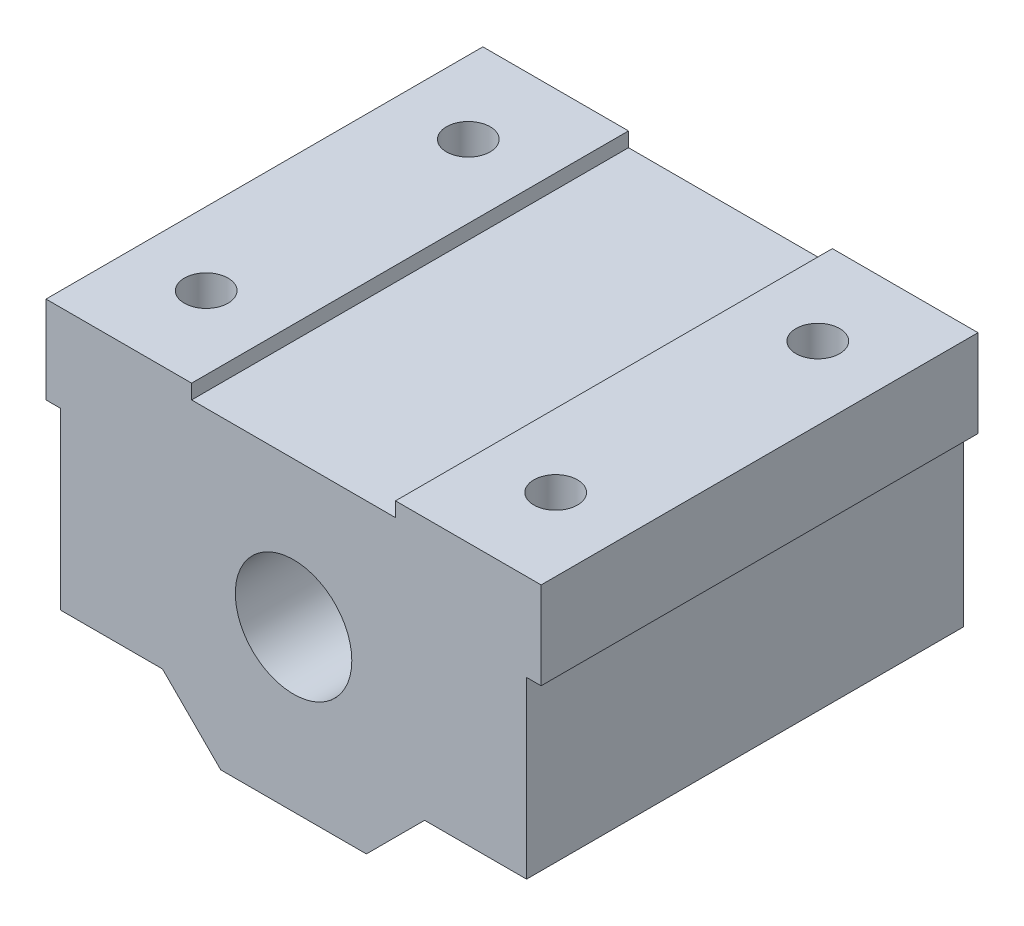
ISO-10303-21;
HEADER;
FILE_DESCRIPTION(('STEP AP214'),'2;1');
FILE_NAME('part.step','',(''),(''),'','','');
FILE_SCHEMA(('AUTOMOTIVE_DESIGN { 1 0 10303 214 1 1 1 1 }'));
ENDSEC;
DATA;
#1=APPLICATION_CONTEXT('core data for automotive mechanical design processes');
#2=APPLICATION_PROTOCOL_DEFINITION('international standard','automotive_design',2000,#1);
#3=PRODUCT_CONTEXT('',#1,'mechanical');
#4=PRODUCT('Part','Part','',(#3));
#5=PRODUCT_RELATED_PRODUCT_CATEGORY('part','',(#4));
#6=PRODUCT_DEFINITION_FORMATION('','',#4);
#7=PRODUCT_DEFINITION_CONTEXT('part definition',#1,'design');
#8=PRODUCT_DEFINITION('design','',#6,#7);
#9=PRODUCT_DEFINITION_SHAPE('','',#8);
#10=(LENGTH_UNIT() NAMED_UNIT(*) SI_UNIT(.MILLI.,.METRE.));
#11=(NAMED_UNIT(*) PLANE_ANGLE_UNIT() SI_UNIT($,.RADIAN.));
#12=(NAMED_UNIT(*) SI_UNIT($,.STERADIAN.) SOLID_ANGLE_UNIT());
#13=UNCERTAINTY_MEASURE_WITH_UNIT(LENGTH_MEASURE(1.E-05),#10,'distance_accuracy_value','');
#14=(GEOMETRIC_REPRESENTATION_CONTEXT(3) GLOBAL_UNCERTAINTY_ASSIGNED_CONTEXT((#13)) GLOBAL_UNIT_ASSIGNED_CONTEXT((#10,
#11,#12)) REPRESENTATION_CONTEXT('',''));
#15=CARTESIAN_POINT('',(0.,0.,0.));
#16=DIRECTION('',(0.,0.,1.));
#17=DIRECTION('',(1.,0.,0.));
#18=AXIS2_PLACEMENT_3D('',#15,#16,#17);
#19=CARTESIAN_POINT('',(-7.82031384772266,-23.8203138477226,30.));
#20=DIRECTION('',(0.707106781186547,-0.707106781186548,0.));
#21=DIRECTION('',(0.707106781186548,0.707106781186547,0.));
#22=AXIS2_PLACEMENT_3D('',#19,#20,#21);
#23=PLANE('',#22);
#24=DIRECTION('',(-0.707106781186548,-0.707106781186547,0.));
#25=VECTOR('',#24,1.);
#26=CARTESIAN_POINT('',(-7.82031384772266,-23.8203138477226,0.));
#27=LINE('',#26,#25);
#28=CARTESIAN_POINT('',(9.00000000000001,-7.00000000000002,0.));
#29=VERTEX_POINT('',#28);
#30=CARTESIAN_POINT('',(5.00000000000001,-11.,0.));
#31=VERTEX_POINT('',#30);
#32=EDGE_CURVE('E209',#29,#31,#27,.T.);
#33=ORIENTED_EDGE('',*,*,#32,.F.);
#34=DIRECTION('',(0.,0.,-1.));
#35=VECTOR('',#34,1.);
#36=CARTESIAN_POINT('',(9.00000000000001,-7.00000000000002,30.));
#37=LINE('',#36,#35);
#38=CARTESIAN_POINT('',(9.00000000000001,-7.00000000000002,30.));
#39=VERTEX_POINT('',#38);
#40=EDGE_CURVE('E11',#39,#29,#37,.T.);
#41=ORIENTED_EDGE('',*,*,#40,.F.);
#42=DIRECTION('',(-0.707106781186548,-0.707106781186547,0.));
#43=VECTOR('',#42,1.);
#44=CARTESIAN_POINT('',(-7.82031384772266,-23.8203138477226,30.));
#45=LINE('',#44,#43);
#46=CARTESIAN_POINT('',(5.00000000000001,-11.,30.));
#47=VERTEX_POINT('',#46);
#48=EDGE_CURVE('E223',#39,#47,#45,.T.);
#49=ORIENTED_EDGE('',*,*,#48,.T.);
#50=DIRECTION('',(0.,0.,-1.));
#51=VECTOR('',#50,1.);
#52=CARTESIAN_POINT('',(5.00000000000001,-11.,30.));
#53=LINE('',#52,#51);
#54=EDGE_CURVE('E110',#47,#31,#53,.T.);
#55=ORIENTED_EDGE('',*,*,#54,.T.);
#56=EDGE_LOOP('',(#33,#41,#49,#55));
#57=FACE_BOUND('',#56,.T.);
#58=ADVANCED_FACE('F33',(#57),#23,.T.);
#59=CARTESIAN_POINT('',(0.,-7.00000000000002,30.));
#60=DIRECTION('',(0.,1.,0.));
#61=DIRECTION('',(0.,0.,1.));
#62=AXIS2_PLACEMENT_3D('',#59,#60,#61);
#63=PLANE('',#62);
#64=CARTESIAN_POINT('',(12.,-7.00000000000002,6.));
#65=DIRECTION('',(0.,1.,0.));
#66=DIRECTION('',(0.,0.,1.));
#67=AXIS2_PLACEMENT_3D('',#64,#65,#66);
#68=CIRCLE('',#67,1.5);
#69=CARTESIAN_POINT('',(12.,-7.00000000000002,7.5));
#70=VERTEX_POINT('',#69);
#71=EDGE_CURVE('E388',#70,#70,#68,.T.);
#72=ORIENTED_EDGE('',*,*,#71,.T.);
#73=EDGE_LOOP('',(#72));
#74=FACE_BOUND('',#73,.T.);
#75=CARTESIAN_POINT('',(12.,-7.00000000000002,24.));
#76=DIRECTION('',(0.,1.,0.));
#77=DIRECTION('',(0.,0.,1.));
#78=AXIS2_PLACEMENT_3D('',#75,#76,#77);
#79=CIRCLE('',#78,1.5);
#80=CARTESIAN_POINT('',(12.,-7.00000000000002,25.5));
#81=VERTEX_POINT('',#80);
#82=EDGE_CURVE('E392',#81,#81,#79,.T.);
#83=ORIENTED_EDGE('',*,*,#82,.T.);
#84=EDGE_LOOP('',(#83));
#85=FACE_BOUND('',#84,.T.);
#86=DIRECTION('',(1.,0.,0.));
#87=VECTOR('',#86,1.);
#88=CARTESIAN_POINT('',(0.,-7.00000000000002,0.));
#89=LINE('',#88,#87);
#90=CARTESIAN_POINT('',(16.,-7.00000000000001,0.));
#91=VERTEX_POINT('',#90);
#92=EDGE_CURVE('E258',#29,#91,#89,.T.);
#93=ORIENTED_EDGE('',*,*,#92,.T.);
#94=DIRECTION('',(0.,0.,-1.));
#95=VECTOR('',#94,1.);
#96=CARTESIAN_POINT('',(16.,-7.00000000000001,30.));
#97=LINE('',#96,#95);
#98=CARTESIAN_POINT('',(16.,-7.00000000000001,30.));
#99=VERTEX_POINT('',#98);
#100=EDGE_CURVE('E43',#99,#91,#97,.T.);
#101=ORIENTED_EDGE('',*,*,#100,.F.);
#102=DIRECTION('',(1.,0.,0.));
#103=VECTOR('',#102,1.);
#104=CARTESIAN_POINT('',(0.,-7.00000000000002,30.));
#105=LINE('',#104,#103);
#106=EDGE_CURVE('E225',#39,#99,#105,.T.);
#107=ORIENTED_EDGE('',*,*,#106,.F.);
#108=ORIENTED_EDGE('',*,*,#40,.T.);
#109=EDGE_LOOP('',(#93,#101,#107,#108));
#110=FACE_BOUND('',#109,.T.);
#111=ADVANCED_FACE('F302',(#74,#85,#110),#63,.F.);
#112=CARTESIAN_POINT('',(16.,-31.6406276954453,30.));
#113=DIRECTION('',(1.,0.,0.));
#114=DIRECTION('',(0.,1.,0.));
#115=AXIS2_PLACEMENT_3D('',#112,#113,#114);
#116=PLANE('',#115);
#117=DIRECTION('',(0.,-1.,0.));
#118=VECTOR('',#117,1.);
#119=CARTESIAN_POINT('',(16.,-31.6406276954453,0.));
#120=LINE('',#119,#118);
#121=CARTESIAN_POINT('',(16.,4.99999999999998,0.));
#122=VERTEX_POINT('',#121);
#123=EDGE_CURVE('E261',#122,#91,#120,.T.);
#124=ORIENTED_EDGE('',*,*,#123,.F.);
#125=DIRECTION('',(0.,0.,-1.));
#126=VECTOR('',#125,1.);
#127=CARTESIAN_POINT('',(16.,4.99999999999998,30.));
#128=LINE('',#127,#126);
#129=CARTESIAN_POINT('',(16.,4.99999999999998,30.));
#130=VERTEX_POINT('',#129);
#131=EDGE_CURVE('E200',#130,#122,#128,.T.);
#132=ORIENTED_EDGE('',*,*,#131,.F.);
#133=DIRECTION('',(0.,-1.,0.));
#134=VECTOR('',#133,1.);
#135=CARTESIAN_POINT('',(16.,-31.6406276954453,30.));
#136=LINE('',#135,#134);
#137=EDGE_CURVE('E227',#130,#99,#136,.T.);
#138=ORIENTED_EDGE('',*,*,#137,.T.);
#139=ORIENTED_EDGE('',*,*,#100,.T.);
#140=EDGE_LOOP('',(#124,#132,#138,#139));
#141=FACE_BOUND('',#140,.T.);
#142=ADVANCED_FACE('F306',(#141),#116,.T.);
#143=CARTESIAN_POINT('',(0.,4.99999999999999,30.));
#144=DIRECTION('',(0.,1.,0.));
#145=DIRECTION('',(0.,0.,1.));
#146=AXIS2_PLACEMENT_3D('',#143,#144,#145);
#147=PLANE('',#146);
#148=DIRECTION('',(1.,0.,0.));
#149=VECTOR('',#148,1.);
#150=CARTESIAN_POINT('',(0.,4.99999999999999,0.));
#151=LINE('',#150,#149);
#152=CARTESIAN_POINT('',(17.,4.99999999999999,0.));
#153=VERTEX_POINT('',#152);
#154=EDGE_CURVE('E264',#122,#153,#151,.T.);
#155=ORIENTED_EDGE('',*,*,#154,.T.);
#156=DIRECTION('',(0.,0.,-1.));
#157=VECTOR('',#156,1.);
#158=CARTESIAN_POINT('',(17.,4.99999999999999,30.));
#159=LINE('',#158,#157);
#160=CARTESIAN_POINT('',(17.,4.99999999999999,30.));
#161=VERTEX_POINT('',#160);
#162=EDGE_CURVE('E197',#161,#153,#159,.T.);
#163=ORIENTED_EDGE('',*,*,#162,.F.);
#164=DIRECTION('',(1.,0.,0.));
#165=VECTOR('',#164,1.);
#166=CARTESIAN_POINT('',(0.,4.99999999999999,30.));
#167=LINE('',#166,#165);
#168=EDGE_CURVE('E230',#130,#161,#167,.T.);
#169=ORIENTED_EDGE('',*,*,#168,.F.);
#170=ORIENTED_EDGE('',*,*,#131,.T.);
#171=EDGE_LOOP('',(#155,#163,#169,#170));
#172=FACE_BOUND('',#171,.T.);
#173=ADVANCED_FACE('F312',(#172),#147,.F.);
#174=CARTESIAN_POINT('',(17.,-31.6406276954453,30.));
#175=DIRECTION('',(-1.,0.,0.));
#176=DIRECTION('',(0.,0.,1.));
#177=AXIS2_PLACEMENT_3D('',#174,#175,#176);
#178=PLANE('',#177);
#179=DIRECTION('',(0.,1.,0.));
#180=VECTOR('',#179,1.);
#181=CARTESIAN_POINT('',(17.,-31.6406276954453,0.));
#182=LINE('',#181,#180);
#183=CARTESIAN_POINT('',(17.,11.,0.));
#184=VERTEX_POINT('',#183);
#185=EDGE_CURVE('E267',#153,#184,#182,.T.);
#186=ORIENTED_EDGE('',*,*,#185,.T.);
#187=DIRECTION('',(0.,0.,-1.));
#188=VECTOR('',#187,1.);
#189=CARTESIAN_POINT('',(17.,11.,30.));
#190=LINE('',#189,#188);
#191=CARTESIAN_POINT('',(17.,11.,30.));
#192=VERTEX_POINT('',#191);
#193=EDGE_CURVE('E195',#192,#184,#190,.T.);
#194=ORIENTED_EDGE('',*,*,#193,.F.);
#195=DIRECTION('',(0.,1.,0.));
#196=VECTOR('',#195,1.);
#197=CARTESIAN_POINT('',(17.,-31.6406276954453,30.));
#198=LINE('',#197,#196);
#199=EDGE_CURVE('E233',#161,#192,#198,.T.);
#200=ORIENTED_EDGE('',*,*,#199,.F.);
#201=ORIENTED_EDGE('',*,*,#162,.T.);
#202=EDGE_LOOP('',(#186,#194,#200,#201));
#203=FACE_BOUND('',#202,.T.);
#204=ADVANCED_FACE('F316',(#203),#178,.F.);
#205=CARTESIAN_POINT('',(0.,11.,30.));
#206=DIRECTION('',(0.,1.,0.));
#207=DIRECTION('',(0.,0.,1.));
#208=AXIS2_PLACEMENT_3D('',#205,#206,#207);
#209=PLANE('',#208);
#210=CARTESIAN_POINT('',(12.,11.,6.));
#211=DIRECTION('',(0.,1.,0.));
#212=DIRECTION('',(0.,0.,1.));
#213=AXIS2_PLACEMENT_3D('',#210,#211,#212);
#214=CIRCLE('',#213,1.5);
#215=CARTESIAN_POINT('',(12.,11.,7.5));
#216=VERTEX_POINT('',#215);
#217=EDGE_CURVE('E385',#216,#216,#214,.T.);
#218=ORIENTED_EDGE('',*,*,#217,.F.);
#219=EDGE_LOOP('',(#218));
#220=FACE_BOUND('',#219,.T.);
#221=CARTESIAN_POINT('',(12.,11.,24.));
#222=DIRECTION('',(0.,1.,0.));
#223=DIRECTION('',(0.,0.,1.));
#224=AXIS2_PLACEMENT_3D('',#221,#222,#223);
#225=CIRCLE('',#224,1.5);
#226=CARTESIAN_POINT('',(12.,11.,25.5));
#227=VERTEX_POINT('',#226);
#228=EDGE_CURVE('E389',#227,#227,#225,.T.);
#229=ORIENTED_EDGE('',*,*,#228,.F.);
#230=EDGE_LOOP('',(#229));
#231=FACE_BOUND('',#230,.T.);
#232=DIRECTION('',(1.,0.,0.));
#233=VECTOR('',#232,1.);
#234=CARTESIAN_POINT('',(0.,11.,0.));
#235=LINE('',#234,#233);
#236=CARTESIAN_POINT('',(7.00000000000001,11.,0.));
#237=VERTEX_POINT('',#236);
#238=EDGE_CURVE('E270',#237,#184,#235,.T.);
#239=ORIENTED_EDGE('',*,*,#238,.F.);
#240=DIRECTION('',(0.,0.,-1.));
#241=VECTOR('',#240,1.);
#242=CARTESIAN_POINT('',(7.00000000000001,11.,30.));
#243=LINE('',#242,#241);
#244=CARTESIAN_POINT('',(7.00000000000001,11.,30.));
#245=VERTEX_POINT('',#244);
#246=EDGE_CURVE('E193',#245,#237,#243,.T.);
#247=ORIENTED_EDGE('',*,*,#246,.F.);
#248=DIRECTION('',(1.,0.,0.));
#249=VECTOR('',#248,1.);
#250=CARTESIAN_POINT('',(0.,11.,30.));
#251=LINE('',#250,#249);
#252=EDGE_CURVE('E235',#245,#192,#251,.T.);
#253=ORIENTED_EDGE('',*,*,#252,.T.);
#254=ORIENTED_EDGE('',*,*,#193,.T.);
#255=EDGE_LOOP('',(#239,#247,#253,#254));
#256=FACE_BOUND('',#255,.T.);
#257=ADVANCED_FACE('F320',(#220,#231,#256),#209,.T.);
#258=CARTESIAN_POINT('',(6.99999999999997,-31.6406276954453,30.));
#259=DIRECTION('',(-1.,0.,0.));
#260=DIRECTION('',(0.,-1.,0.));
#261=AXIS2_PLACEMENT_3D('',#258,#259,#260);
#262=PLANE('',#261);
#263=DIRECTION('',(0.,1.,0.));
#264=VECTOR('',#263,1.);
#265=CARTESIAN_POINT('',(6.99999999999997,-31.6406276954453,0.));
#266=LINE('',#265,#264);
#267=CARTESIAN_POINT('',(7.,9.99999999999999,0.));
#268=VERTEX_POINT('',#267);
#269=EDGE_CURVE('E273',#268,#237,#266,.T.);
#270=ORIENTED_EDGE('',*,*,#269,.F.);
#271=DIRECTION('',(0.,0.,-1.));
#272=VECTOR('',#271,1.);
#273=CARTESIAN_POINT('',(7.,9.99999999999999,30.));
#274=LINE('',#273,#272);
#275=CARTESIAN_POINT('',(7.,9.99999999999999,30.));
#276=VERTEX_POINT('',#275);
#277=EDGE_CURVE('E191',#276,#268,#274,.T.);
#278=ORIENTED_EDGE('',*,*,#277,.F.);
#279=DIRECTION('',(0.,1.,0.));
#280=VECTOR('',#279,1.);
#281=CARTESIAN_POINT('',(6.99999999999997,-31.6406276954453,30.));
#282=LINE('',#281,#280);
#283=EDGE_CURVE('E238',#276,#245,#282,.T.);
#284=ORIENTED_EDGE('',*,*,#283,.T.);
#285=ORIENTED_EDGE('',*,*,#246,.T.);
#286=EDGE_LOOP('',(#270,#278,#284,#285));
#287=FACE_BOUND('',#286,.T.);
#288=ADVANCED_FACE('F324',(#287),#262,.T.);
#289=CARTESIAN_POINT('',(0.,9.99999999999999,30.));
#290=DIRECTION('',(0.,1.,0.));
#291=DIRECTION('',(0.,0.,1.));
#292=AXIS2_PLACEMENT_3D('',#289,#290,#291);
#293=PLANE('',#292);
#294=DIRECTION('',(1.,0.,0.));
#295=VECTOR('',#294,1.);
#296=CARTESIAN_POINT('',(0.,9.99999999999999,0.));
#297=LINE('',#296,#295);
#298=CARTESIAN_POINT('',(-7.00000000000002,9.99999999999999,0.));
#299=VERTEX_POINT('',#298);
#300=EDGE_CURVE('E276',#299,#268,#297,.T.);
#301=ORIENTED_EDGE('',*,*,#300,.F.);
#302=DIRECTION('',(0.,0.,-1.));
#303=VECTOR('',#302,1.);
#304=CARTESIAN_POINT('',(-7.00000000000002,9.99999999999999,30.));
#305=LINE('',#304,#303);
#306=CARTESIAN_POINT('',(-7.00000000000002,9.99999999999999,30.));
#307=VERTEX_POINT('',#306);
#308=EDGE_CURVE('E189',#307,#299,#305,.T.);
#309=ORIENTED_EDGE('',*,*,#308,.F.);
#310=DIRECTION('',(1.,0.,0.));
#311=VECTOR('',#310,1.);
#312=CARTESIAN_POINT('',(0.,9.99999999999999,30.));
#313=LINE('',#312,#311);
#314=EDGE_CURVE('E241',#307,#276,#313,.T.);
#315=ORIENTED_EDGE('',*,*,#314,.T.);
#316=ORIENTED_EDGE('',*,*,#277,.T.);
#317=EDGE_LOOP('',(#301,#309,#315,#316));
#318=FACE_BOUND('',#317,.T.);
#319=ADVANCED_FACE('F328',(#318),#293,.T.);
#320=CARTESIAN_POINT('',(-7.00000000000002,-31.6406276954453,30.));
#321=DIRECTION('',(-1.,0.,0.));
#322=DIRECTION('',(0.,0.,1.));
#323=AXIS2_PLACEMENT_3D('',#320,#321,#322);
#324=PLANE('',#323);
#325=DIRECTION('',(0.,1.,0.));
#326=VECTOR('',#325,1.);
#327=CARTESIAN_POINT('',(-7.00000000000002,-31.6406276954453,0.));
#328=LINE('',#327,#326);
#329=CARTESIAN_POINT('',(-7.00000000000002,11.,0.));
#330=VERTEX_POINT('',#329);
#331=EDGE_CURVE('E279',#299,#330,#328,.T.);
#332=ORIENTED_EDGE('',*,*,#331,.T.);
#333=DIRECTION('',(0.,0.,-1.));
#334=VECTOR('',#333,1.);
#335=CARTESIAN_POINT('',(-7.00000000000002,11.,30.));
#336=LINE('',#335,#334);
#337=CARTESIAN_POINT('',(-7.00000000000002,11.,30.));
#338=VERTEX_POINT('',#337);
#339=EDGE_CURVE('E187',#338,#330,#336,.T.);
#340=ORIENTED_EDGE('',*,*,#339,.F.);
#341=DIRECTION('',(0.,1.,0.));
#342=VECTOR('',#341,1.);
#343=CARTESIAN_POINT('',(-7.00000000000002,-31.6406276954453,30.));
#344=LINE('',#343,#342);
#345=EDGE_CURVE('E244',#307,#338,#344,.T.);
#346=ORIENTED_EDGE('',*,*,#345,.F.);
#347=ORIENTED_EDGE('',*,*,#308,.T.);
#348=EDGE_LOOP('',(#332,#340,#346,#347));
#349=FACE_BOUND('',#348,.T.);
#350=ADVANCED_FACE('F332',(#349),#324,.F.);
#351=CARTESIAN_POINT('',(0.,11.,30.));
#352=DIRECTION('',(0.,1.,0.));
#353=DIRECTION('',(0.,0.,1.));
#354=AXIS2_PLACEMENT_3D('',#351,#352,#353);
#355=PLANE('',#354);
#356=CARTESIAN_POINT('',(-12.,11.,6.));
#357=DIRECTION('',(0.,1.,0.));
#358=DIRECTION('',(0.,0.,1.));
#359=AXIS2_PLACEMENT_3D('',#356,#357,#358);
#360=CIRCLE('',#359,1.5);
#361=CARTESIAN_POINT('',(-12.,11.,7.5));
#362=VERTEX_POINT('',#361);
#363=EDGE_CURVE('E216',#362,#362,#360,.T.);
#364=ORIENTED_EDGE('',*,*,#363,.F.);
#365=EDGE_LOOP('',(#364));
#366=FACE_BOUND('',#365,.T.);
#367=CARTESIAN_POINT('',(-12.,11.,24.));
#368=DIRECTION('',(0.,1.,0.));
#369=DIRECTION('',(0.,0.,1.));
#370=AXIS2_PLACEMENT_3D('',#367,#368,#369);
#371=CIRCLE('',#370,1.5);
#372=CARTESIAN_POINT('',(-12.,11.,25.5));
#373=VERTEX_POINT('',#372);
#374=EDGE_CURVE('E205',#373,#373,#371,.T.);
#375=ORIENTED_EDGE('',*,*,#374,.F.);
#376=EDGE_LOOP('',(#375));
#377=FACE_BOUND('',#376,.T.);
#378=DIRECTION('',(1.,0.,0.));
#379=VECTOR('',#378,1.);
#380=CARTESIAN_POINT('',(0.,11.,0.));
#381=LINE('',#380,#379);
#382=CARTESIAN_POINT('',(-17.,11.,0.));
#383=VERTEX_POINT('',#382);
#384=EDGE_CURVE('E282',#383,#330,#381,.T.);
#385=ORIENTED_EDGE('',*,*,#384,.F.);
#386=DIRECTION('',(0.,0.,-1.));
#387=VECTOR('',#386,1.);
#388=CARTESIAN_POINT('',(-17.,11.,30.));
#389=LINE('',#388,#387);
#390=CARTESIAN_POINT('',(-17.,11.,30.));
#391=VERTEX_POINT('',#390);
#392=EDGE_CURVE('E185',#391,#383,#389,.T.);
#393=ORIENTED_EDGE('',*,*,#392,.F.);
#394=DIRECTION('',(1.,0.,0.));
#395=VECTOR('',#394,1.);
#396=CARTESIAN_POINT('',(0.,11.,30.));
#397=LINE('',#396,#395);
#398=EDGE_CURVE('E246',#391,#338,#397,.T.);
#399=ORIENTED_EDGE('',*,*,#398,.T.);
#400=ORIENTED_EDGE('',*,*,#339,.T.);
#401=EDGE_LOOP('',(#385,#393,#399,#400));
#402=FACE_BOUND('',#401,.T.);
#403=ADVANCED_FACE('F336',(#366,#377,#402),#355,.T.);
#404=CARTESIAN_POINT('',(-17.,-31.6406276954453,30.));
#405=DIRECTION('',(-1.,0.,0.));
#406=DIRECTION('',(0.,0.,1.));
#407=AXIS2_PLACEMENT_3D('',#404,#405,#406);
#408=PLANE('',#407);
#409=DIRECTION('',(0.,1.,0.));
#410=VECTOR('',#409,1.);
#411=CARTESIAN_POINT('',(-17.,-31.6406276954453,0.));
#412=LINE('',#411,#410);
#413=CARTESIAN_POINT('',(-17.,4.99999999999999,0.));
#414=VERTEX_POINT('',#413);
#415=EDGE_CURVE('E285',#414,#383,#412,.T.);
#416=ORIENTED_EDGE('',*,*,#415,.F.);
#417=DIRECTION('',(0.,0.,-1.));
#418=VECTOR('',#417,1.);
#419=CARTESIAN_POINT('',(-17.,4.99999999999999,30.));
#420=LINE('',#419,#418);
#421=CARTESIAN_POINT('',(-17.,4.99999999999999,30.));
#422=VERTEX_POINT('',#421);
#423=EDGE_CURVE('E183',#422,#414,#420,.T.);
#424=ORIENTED_EDGE('',*,*,#423,.F.);
#425=DIRECTION('',(0.,1.,0.));
#426=VECTOR('',#425,1.);
#427=CARTESIAN_POINT('',(-17.,-31.6406276954453,30.));
#428=LINE('',#427,#426);
#429=EDGE_CURVE('E249',#422,#391,#428,.T.);
#430=ORIENTED_EDGE('',*,*,#429,.T.);
#431=ORIENTED_EDGE('',*,*,#392,.T.);
#432=EDGE_LOOP('',(#416,#424,#430,#431));
#433=FACE_BOUND('',#432,.T.);
#434=ADVANCED_FACE('F340',(#433),#408,.T.);
#435=CARTESIAN_POINT('',(0.,4.99999999999999,30.));
#436=DIRECTION('',(0.,-1.,0.));
#437=DIRECTION('',(0.,0.,-1.));
#438=AXIS2_PLACEMENT_3D('',#435,#436,#437);
#439=PLANE('',#438);
#440=DIRECTION('',(-1.,0.,0.));
#441=VECTOR('',#440,1.);
#442=CARTESIAN_POINT('',(0.,4.99999999999999,0.));
#443=LINE('',#442,#441);
#444=CARTESIAN_POINT('',(-16.,4.99999999999998,0.));
#445=VERTEX_POINT('',#444);
#446=EDGE_CURVE('E288',#445,#414,#443,.T.);
#447=ORIENTED_EDGE('',*,*,#446,.F.);
#448=DIRECTION('',(0.,0.,-1.));
#449=VECTOR('',#448,1.);
#450=CARTESIAN_POINT('',(-16.,4.99999999999998,30.));
#451=LINE('',#450,#449);
#452=CARTESIAN_POINT('',(-16.,4.99999999999998,30.));
#453=VERTEX_POINT('',#452);
#454=EDGE_CURVE('E177',#453,#445,#451,.T.);
#455=ORIENTED_EDGE('',*,*,#454,.F.);
#456=DIRECTION('',(-1.,0.,0.));
#457=VECTOR('',#456,1.);
#458=CARTESIAN_POINT('',(0.,4.99999999999999,30.));
#459=LINE('',#458,#457);
#460=EDGE_CURVE('E252',#453,#422,#459,.T.);
#461=ORIENTED_EDGE('',*,*,#460,.T.);
#462=ORIENTED_EDGE('',*,*,#423,.T.);
#463=EDGE_LOOP('',(#447,#455,#461,#462));
#464=FACE_BOUND('',#463,.T.);
#465=ADVANCED_FACE('F344',(#464),#439,.T.);
#466=CARTESIAN_POINT('',(-16.,-31.6406276954453,30.));
#467=DIRECTION('',(1.,0.,0.));
#468=DIRECTION('',(0.,0.,-1.));
#469=AXIS2_PLACEMENT_3D('',#466,#467,#468);
#470=PLANE('',#469);
#471=DIRECTION('',(0.,-1.,0.));
#472=VECTOR('',#471,1.);
#473=CARTESIAN_POINT('',(-16.,-31.6406276954453,0.));
#474=LINE('',#473,#472);
#475=CARTESIAN_POINT('',(-16.,-7.00000000000002,0.));
#476=VERTEX_POINT('',#475);
#477=EDGE_CURVE('E291',#445,#476,#474,.T.);
#478=ORIENTED_EDGE('',*,*,#477,.T.);
#479=DIRECTION('',(0.,0.,-1.));
#480=VECTOR('',#479,1.);
#481=CARTESIAN_POINT('',(-16.,-7.00000000000002,30.));
#482=LINE('',#481,#480);
#483=CARTESIAN_POINT('',(-16.,-7.00000000000002,30.));
#484=VERTEX_POINT('',#483);
#485=EDGE_CURVE('E175',#484,#476,#482,.T.);
#486=ORIENTED_EDGE('',*,*,#485,.F.);
#487=DIRECTION('',(0.,-1.,0.));
#488=VECTOR('',#487,1.);
#489=CARTESIAN_POINT('',(-16.,-31.6406276954453,30.));
#490=LINE('',#489,#488);
#491=EDGE_CURVE('E168',#453,#484,#490,.T.);
#492=ORIENTED_EDGE('',*,*,#491,.F.);
#493=ORIENTED_EDGE('',*,*,#454,.T.);
#494=EDGE_LOOP('',(#478,#486,#492,#493));
#495=FACE_BOUND('',#494,.T.);
#496=ADVANCED_FACE('F348',(#495),#470,.F.);
#497=CARTESIAN_POINT('',(0.,-7.00000000000002,30.));
#498=DIRECTION('',(0.,1.,0.));
#499=DIRECTION('',(0.,0.,1.));
#500=AXIS2_PLACEMENT_3D('',#497,#498,#499);
#501=PLANE('',#500);
#502=CARTESIAN_POINT('',(-12.,-7.00000000000002,6.));
#503=DIRECTION('',(0.,1.,0.));
#504=DIRECTION('',(0.,0.,1.));
#505=AXIS2_PLACEMENT_3D('',#502,#503,#504);
#506=CIRCLE('',#505,1.5);
#507=CARTESIAN_POINT('',(-12.,-7.00000000000002,7.5));
#508=VERTEX_POINT('',#507);
#509=EDGE_CURVE('E37',#508,#508,#506,.T.);
#510=ORIENTED_EDGE('',*,*,#509,.T.);
#511=EDGE_LOOP('',(#510));
#512=FACE_BOUND('',#511,.T.);
#513=CARTESIAN_POINT('',(-12.,-7.00000000000002,24.));
#514=DIRECTION('',(0.,1.,0.));
#515=DIRECTION('',(0.,0.,1.));
#516=AXIS2_PLACEMENT_3D('',#513,#514,#515);
#517=CIRCLE('',#516,1.5);
#518=CARTESIAN_POINT('',(-12.,-7.00000000000002,25.5));
#519=VERTEX_POINT('',#518);
#520=EDGE_CURVE('E202',#519,#519,#517,.T.);
#521=ORIENTED_EDGE('',*,*,#520,.T.);
#522=EDGE_LOOP('',(#521));
#523=FACE_BOUND('',#522,.T.);
#524=DIRECTION('',(1.,0.,0.));
#525=VECTOR('',#524,1.);
#526=CARTESIAN_POINT('',(0.,-7.00000000000002,0.));
#527=LINE('',#526,#525);
#528=CARTESIAN_POINT('',(-9.00000000000002,-7.00000000000002,0.));
#529=VERTEX_POINT('',#528);
#530=EDGE_CURVE('E174',#476,#529,#527,.T.);
#531=ORIENTED_EDGE('',*,*,#530,.T.);
#532=DIRECTION('',(0.,0.,-1.));
#533=VECTOR('',#532,1.);
#534=CARTESIAN_POINT('',(-9.00000000000002,-7.00000000000002,30.));
#535=LINE('',#534,#533);
#536=CARTESIAN_POINT('',(-9.00000000000002,-7.00000000000002,30.));
#537=VERTEX_POINT('',#536);
#538=EDGE_CURVE('E159',#537,#529,#535,.T.);
#539=ORIENTED_EDGE('',*,*,#538,.F.);
#540=DIRECTION('',(1.,0.,0.));
#541=VECTOR('',#540,1.);
#542=CARTESIAN_POINT('',(0.,-7.00000000000002,30.));
#543=LINE('',#542,#541);
#544=EDGE_CURVE('E162',#484,#537,#543,.T.);
#545=ORIENTED_EDGE('',*,*,#544,.F.);
#546=ORIENTED_EDGE('',*,*,#485,.T.);
#547=EDGE_LOOP('',(#531,#539,#545,#546));
#548=FACE_BOUND('',#547,.T.);
#549=ADVANCED_FACE('F173',(#512,#523,#548),#501,.F.);
#550=CARTESIAN_POINT('',(7.82031384772265,-23.8203138477227,30.));
#551=DIRECTION('',(0.707106781186547,0.707106781186548,0.));
#552=DIRECTION('',(-0.707106781186548,0.707106781186547,0.));
#553=AXIS2_PLACEMENT_3D('',#550,#551,#552);
#554=PLANE('',#553);
#555=DIRECTION('',(0.707106781186548,-0.707106781186547,0.));
#556=VECTOR('',#555,1.);
#557=CARTESIAN_POINT('',(7.82031384772265,-23.8203138477227,0.));
#558=LINE('',#557,#556);
#559=CARTESIAN_POINT('',(-5.00000000000002,-11.,0.));
#560=VERTEX_POINT('',#559);
#561=EDGE_CURVE('E295',#529,#560,#558,.T.);
#562=ORIENTED_EDGE('',*,*,#561,.T.);
#563=DIRECTION('',(0.,0.,-1.));
#564=VECTOR('',#563,1.);
#565=CARTESIAN_POINT('',(-5.00000000000002,-11.,30.));
#566=LINE('',#565,#564);
#567=CARTESIAN_POINT('',(-5.00000000000002,-11.,30.));
#568=VERTEX_POINT('',#567);
#569=EDGE_CURVE('E161',#568,#560,#566,.T.);
#570=ORIENTED_EDGE('',*,*,#569,.F.);
#571=DIRECTION('',(0.707106781186548,-0.707106781186547,0.));
#572=VECTOR('',#571,1.);
#573=CARTESIAN_POINT('',(7.82031384772265,-23.8203138477227,30.));
#574=LINE('',#573,#572);
#575=EDGE_CURVE('E154',#537,#568,#574,.T.);
#576=ORIENTED_EDGE('',*,*,#575,.F.);
#577=ORIENTED_EDGE('',*,*,#538,.T.);
#578=EDGE_LOOP('',(#562,#570,#576,#577));
#579=FACE_BOUND('',#578,.T.);
#580=ADVANCED_FACE('F157',(#579),#554,.F.);
#581=CARTESIAN_POINT('',(0.,0.,30.));
#582=DIRECTION('',(0.,0.,-1.));
#583=DIRECTION('',(-1.,0.,0.));
#584=AXIS2_PLACEMENT_3D('',#581,#582,#583);
#585=CYLINDRICAL_SURFACE('',#584,4.);
#586=CARTESIAN_POINT('',(0.,0.,30.));
#587=DIRECTION('',(0.,0.,1.));
#588=DIRECTION('',(1.,0.,0.));
#589=AXIS2_PLACEMENT_3D('',#586,#587,#588);
#590=CIRCLE('',#589,4.);
#591=CARTESIAN_POINT('',(3.99999999999999,0.,30.));
#592=VERTEX_POINT('',#591);
#593=EDGE_CURVE('E220',#592,#592,#590,.T.);
#594=ORIENTED_EDGE('',*,*,#593,.T.);
#595=EDGE_LOOP('',(#594));
#596=FACE_BOUND('',#595,.T.);
#597=CARTESIAN_POINT('',(0.,0.,0.));
#598=DIRECTION('',(0.,0.,1.));
#599=DIRECTION('',(1.,0.,0.));
#600=AXIS2_PLACEMENT_3D('',#597,#598,#599);
#601=CIRCLE('',#600,4.);
#602=CARTESIAN_POINT('',(3.99999999999999,0.,0.));
#603=VERTEX_POINT('',#602);
#604=EDGE_CURVE('E204',#603,#603,#601,.T.);
#605=ORIENTED_EDGE('',*,*,#604,.F.);
#606=EDGE_LOOP('',(#605));
#607=FACE_BOUND('',#606,.T.);
#608=ADVANCED_FACE('F35',(#596,#607),#585,.F.);
#609=CARTESIAN_POINT('',(0.,-11.,30.));
#610=DIRECTION('',(0.,1.,0.));
#611=DIRECTION('',(0.,0.,1.));
#612=AXIS2_PLACEMENT_3D('',#609,#610,#611);
#613=PLANE('',#612);
#614=DIRECTION('',(1.,0.,0.));
#615=VECTOR('',#614,1.);
#616=CARTESIAN_POINT('',(0.,-11.,0.));
#617=LINE('',#616,#615);
#618=EDGE_CURVE('E103',#560,#31,#617,.T.);
#619=ORIENTED_EDGE('',*,*,#618,.T.);
#620=ORIENTED_EDGE('',*,*,#54,.F.);
#621=DIRECTION('',(1.,0.,0.));
#622=VECTOR('',#621,1.);
#623=CARTESIAN_POINT('',(0.,-11.,30.));
#624=LINE('',#623,#622);
#625=EDGE_CURVE('E52',#568,#47,#624,.T.);
#626=ORIENTED_EDGE('',*,*,#625,.F.);
#627=ORIENTED_EDGE('',*,*,#569,.T.);
#628=EDGE_LOOP('',(#619,#620,#626,#627));
#629=FACE_BOUND('',#628,.T.);
#630=ADVANCED_FACE('F298',(#629),#613,.F.);
#631=CARTESIAN_POINT('',(0.,-31.6406276954453,30.));
#632=DIRECTION('',(0.,0.,1.));
#633=DIRECTION('',(1.,0.,0.));
#634=AXIS2_PLACEMENT_3D('',#631,#632,#633);
#635=PLANE('',#634);
#636=ORIENTED_EDGE('',*,*,#593,.F.);
#637=EDGE_LOOP('',(#636));
#638=FACE_BOUND('',#637,.T.);
#639=ORIENTED_EDGE('',*,*,#48,.F.);
#640=ORIENTED_EDGE('',*,*,#106,.T.);
#641=ORIENTED_EDGE('',*,*,#137,.F.);
#642=ORIENTED_EDGE('',*,*,#168,.T.);
#643=ORIENTED_EDGE('',*,*,#199,.T.);
#644=ORIENTED_EDGE('',*,*,#252,.F.);
#645=ORIENTED_EDGE('',*,*,#283,.F.);
#646=ORIENTED_EDGE('',*,*,#314,.F.);
#647=ORIENTED_EDGE('',*,*,#345,.T.);
#648=ORIENTED_EDGE('',*,*,#398,.F.);
#649=ORIENTED_EDGE('',*,*,#429,.F.);
#650=ORIENTED_EDGE('',*,*,#460,.F.);
#651=ORIENTED_EDGE('',*,*,#491,.T.);
#652=ORIENTED_EDGE('',*,*,#544,.T.);
#653=ORIENTED_EDGE('',*,*,#575,.T.);
#654=ORIENTED_EDGE('',*,*,#625,.T.);
#655=EDGE_LOOP('',(#639,#640,#641,#642,#643,#644,#645,#646,#647,#648,#649,#650,#651,#652,#653,#654));
#656=FACE_BOUND('',#655,.T.);
#657=ADVANCED_FACE('F165',(#638,#656),#635,.T.);
#658=CARTESIAN_POINT('',(0.,-31.6406276954453,0.));
#659=DIRECTION('',(0.,0.,1.));
#660=DIRECTION('',(1.,0.,0.));
#661=AXIS2_PLACEMENT_3D('',#658,#659,#660);
#662=PLANE('',#661);
#663=ORIENTED_EDGE('',*,*,#604,.T.);
#664=EDGE_LOOP('',(#663));
#665=FACE_BOUND('',#664,.T.);
#666=ORIENTED_EDGE('',*,*,#32,.T.);
#667=ORIENTED_EDGE('',*,*,#618,.F.);
#668=ORIENTED_EDGE('',*,*,#561,.F.);
#669=ORIENTED_EDGE('',*,*,#530,.F.);
#670=ORIENTED_EDGE('',*,*,#477,.F.);
#671=ORIENTED_EDGE('',*,*,#446,.T.);
#672=ORIENTED_EDGE('',*,*,#415,.T.);
#673=ORIENTED_EDGE('',*,*,#384,.T.);
#674=ORIENTED_EDGE('',*,*,#331,.F.);
#675=ORIENTED_EDGE('',*,*,#300,.T.);
#676=ORIENTED_EDGE('',*,*,#269,.T.);
#677=ORIENTED_EDGE('',*,*,#238,.T.);
#678=ORIENTED_EDGE('',*,*,#185,.F.);
#679=ORIENTED_EDGE('',*,*,#154,.F.);
#680=ORIENTED_EDGE('',*,*,#123,.T.);
#681=ORIENTED_EDGE('',*,*,#92,.F.);
#682=EDGE_LOOP('',(#666,#667,#668,#669,#670,#671,#672,#673,#674,#675,#676,#677,#678,#679,#680,#681));
#683=FACE_BOUND('',#682,.T.);
#684=ADVANCED_FACE('F300',(#665,#683),#662,.F.);
#685=CARTESIAN_POINT('',(-12.,-19.,24.));
#686=DIRECTION('',(0.,1.,0.));
#687=DIRECTION('',(0.,0.,1.));
#688=AXIS2_PLACEMENT_3D('',#685,#686,#687);
#689=CYLINDRICAL_SURFACE('',#688,1.5);
#690=ORIENTED_EDGE('',*,*,#374,.T.);
#691=EDGE_LOOP('',(#690));
#692=FACE_BOUND('',#691,.T.);
#693=ORIENTED_EDGE('',*,*,#520,.F.);
#694=EDGE_LOOP('',(#693));
#695=FACE_BOUND('',#694,.T.);
#696=ADVANCED_FACE('F362',(#692,#695),#689,.F.);
#697=CARTESIAN_POINT('',(-12.,-19.,6.));
#698=DIRECTION('',(0.,1.,0.));
#699=DIRECTION('',(0.,0.,1.));
#700=AXIS2_PLACEMENT_3D('',#697,#698,#699);
#701=CYLINDRICAL_SURFACE('',#700,1.5);
#702=ORIENTED_EDGE('',*,*,#363,.T.);
#703=EDGE_LOOP('',(#702));
#704=FACE_BOUND('',#703,.T.);
#705=ORIENTED_EDGE('',*,*,#509,.F.);
#706=EDGE_LOOP('',(#705));
#707=FACE_BOUND('',#706,.T.);
#708=ADVANCED_FACE('F369',(#704,#707),#701,.F.);
#709=CARTESIAN_POINT('',(12.,-19.,24.));
#710=DIRECTION('',(0.,1.,0.));
#711=DIRECTION('',(0.,0.,1.));
#712=AXIS2_PLACEMENT_3D('',#709,#710,#711);
#713=CYLINDRICAL_SURFACE('',#712,1.5);
#714=ORIENTED_EDGE('',*,*,#228,.T.);
#715=EDGE_LOOP('',(#714));
#716=FACE_BOUND('',#715,.T.);
#717=ORIENTED_EDGE('',*,*,#82,.F.);
#718=EDGE_LOOP('',(#717));
#719=FACE_BOUND('',#718,.T.);
#720=ADVANCED_FACE('F372',(#716,#719),#713,.F.);
#721=CARTESIAN_POINT('',(12.,-19.,6.));
#722=DIRECTION('',(0.,1.,0.));
#723=DIRECTION('',(0.,0.,1.));
#724=AXIS2_PLACEMENT_3D('',#721,#722,#723);
#725=CYLINDRICAL_SURFACE('',#724,1.5);
#726=ORIENTED_EDGE('',*,*,#217,.T.);
#727=EDGE_LOOP('',(#726));
#728=FACE_BOUND('',#727,.T.);
#729=ORIENTED_EDGE('',*,*,#71,.F.);
#730=EDGE_LOOP('',(#729));
#731=FACE_BOUND('',#730,.T.);
#732=ADVANCED_FACE('F376',(#728,#731),#725,.F.);
#733=CLOSED_SHELL('',(#58,#111,#142,#173,#204,#257,#288,#319,#350,#403,#434,#465,#496,#549,#580,
#608,#630,#657,#684,#696,#708,#720,#732));
#734=MANIFOLD_SOLID_BREP('B2',#733);
#735=ADVANCED_BREP_SHAPE_REPRESENTATION('',(#18,#734),#14);
#736=SHAPE_DEFINITION_REPRESENTATION(#9,#735);
ENDSEC;
END-ISO-10303-21;
